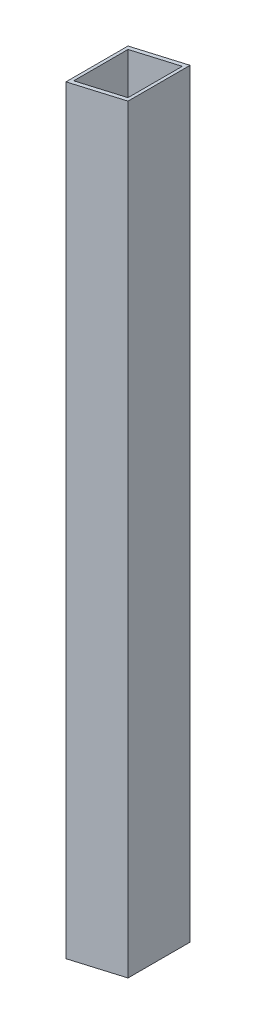
ISO-10303-21;
HEADER;
FILE_DESCRIPTION(('STEP AP214'),'2;1');
FILE_NAME('part.step','',(''),(''),'','','');
FILE_SCHEMA(('AUTOMOTIVE_DESIGN { 1 0 10303 214 1 1 1 1 }'));
ENDSEC;
DATA;
#1=APPLICATION_CONTEXT('core data for automotive mechanical design processes');
#2=APPLICATION_PROTOCOL_DEFINITION('international standard','automotive_design',2000,#1);
#3=PRODUCT_CONTEXT('',#1,'mechanical');
#4=PRODUCT('Part','Part','',(#3));
#5=PRODUCT_RELATED_PRODUCT_CATEGORY('part','',(#4));
#6=PRODUCT_DEFINITION_FORMATION('','',#4);
#7=PRODUCT_DEFINITION_CONTEXT('part definition',#1,'design');
#8=PRODUCT_DEFINITION('design','',#6,#7);
#9=PRODUCT_DEFINITION_SHAPE('','',#8);
#10=(LENGTH_UNIT() NAMED_UNIT(*) SI_UNIT(.MILLI.,.METRE.));
#11=(NAMED_UNIT(*) PLANE_ANGLE_UNIT() SI_UNIT($,.RADIAN.));
#12=(NAMED_UNIT(*) SI_UNIT($,.STERADIAN.) SOLID_ANGLE_UNIT());
#13=UNCERTAINTY_MEASURE_WITH_UNIT(LENGTH_MEASURE(1.E-05),#10,'distance_accuracy_value','');
#14=(GEOMETRIC_REPRESENTATION_CONTEXT(3) GLOBAL_UNCERTAINTY_ASSIGNED_CONTEXT((#13)) GLOBAL_UNIT_ASSIGNED_CONTEXT((#10,
#11,#12)) REPRESENTATION_CONTEXT('',''));
#15=CARTESIAN_POINT('',(0.,0.,0.));
#16=DIRECTION('',(0.,0.,1.));
#17=DIRECTION('',(1.,0.,0.));
#18=AXIS2_PLACEMENT_3D('',#15,#16,#17);
#19=CARTESIAN_POINT('',(0.,950.,0.));
#20=DIRECTION('',(1.,0.,0.));
#21=DIRECTION('',(0.,0.,-1.));
#22=AXIS2_PLACEMENT_3D('',#19,#20,#21);
#23=PLANE('',#22);
#24=DIRECTION('',(0.,-1.,0.));
#25=VECTOR('',#24,1.);
#26=CARTESIAN_POINT('',(0.,950.,76.2));
#27=LINE('',#26,#25);
#28=CARTESIAN_POINT('',(0.,932.407843836233,76.2));
#29=VERTEX_POINT('',#28);
#30=CARTESIAN_POINT('',(0.,0.,76.2));
#31=VERTEX_POINT('',#30);
#32=EDGE_CURVE('E118',#29,#31,#27,.T.);
#33=ORIENTED_EDGE('',*,*,#32,.F.);
#34=DIRECTION('',(0.,0.,1.));
#35=VECTOR('',#34,1.);
#36=CARTESIAN_POINT('',(0.,932.407843836233,0.));
#37=LINE('',#36,#35);
#38=CARTESIAN_POINT('',(0.,932.407843836233,0.));
#39=VERTEX_POINT('',#38);
#40=EDGE_CURVE('E103',#39,#29,#37,.T.);
#41=ORIENTED_EDGE('',*,*,#40,.F.);
#42=DIRECTION('',(0.,-1.,0.));
#43=VECTOR('',#42,1.);
#44=CARTESIAN_POINT('',(0.,950.,0.));
#45=LINE('',#44,#43);
#46=CARTESIAN_POINT('',(0.,0.,0.));
#47=VERTEX_POINT('',#46);
#48=EDGE_CURVE('E116',#39,#47,#45,.T.);
#49=ORIENTED_EDGE('',*,*,#48,.T.);
#50=DIRECTION('',(0.,0.,1.));
#51=VECTOR('',#50,1.);
#52=CARTESIAN_POINT('',(0.,0.,0.));
#53=LINE('',#52,#51);
#54=EDGE_CURVE('E128',#47,#31,#53,.T.);
#55=ORIENTED_EDGE('',*,*,#54,.T.);
#56=EDGE_LOOP('',(#33,#41,#49,#55));
#57=FACE_BOUND('',#56,.T.);
#58=ADVANCED_FACE('F36',(#57),#23,.F.);
#59=CARTESIAN_POINT('',(0.,950.,76.2));
#60=DIRECTION('',(0.,0.,-1.));
#61=DIRECTION('',(-1.,0.,0.));
#62=AXIS2_PLACEMENT_3D('',#59,#60,#61);
#63=PLANE('',#62);
#64=DIRECTION('',(0.,-1.,0.));
#65=VECTOR('',#64,1.);
#66=CARTESIAN_POINT('',(76.2,950.,76.2));
#67=LINE('',#66,#65);
#68=CARTESIAN_POINT('',(76.2,950.,76.2));
#69=VERTEX_POINT('',#68);
#70=CARTESIAN_POINT('',(76.2,17.592156163768,76.2));
#71=VERTEX_POINT('',#70);
#72=EDGE_CURVE('E126',#69,#71,#67,.T.);
#73=ORIENTED_EDGE('',*,*,#72,.F.);
#74=DIRECTION('',(0.974370064785237,0.224951054343859,0.));
#75=VECTOR('',#74,1.);
#76=CARTESIAN_POINT('',(76.2,950.,76.2));
#77=LINE('',#76,#75);
#78=EDGE_CURVE('E111',#29,#69,#77,.T.);
#79=ORIENTED_EDGE('',*,*,#78,.F.);
#80=ORIENTED_EDGE('',*,*,#32,.T.);
#81=DIRECTION('',(-0.974370064785235,-0.224951054343866,0.));
#82=VECTOR('',#81,1.);
#83=CARTESIAN_POINT('',(0.,0.,76.2));
#84=LINE('',#83,#82);
#85=EDGE_CURVE('E164',#71,#31,#84,.T.);
#86=ORIENTED_EDGE('',*,*,#85,.F.);
#87=EDGE_LOOP('',(#73,#79,#80,#86));
#88=FACE_BOUND('',#87,.T.);
#89=ADVANCED_FACE('F176',(#88),#63,.F.);
#90=CARTESIAN_POINT('',(76.2,950.,0.));
#91=DIRECTION('',(-1.,0.,0.));
#92=DIRECTION('',(0.,0.,1.));
#93=AXIS2_PLACEMENT_3D('',#90,#91,#92);
#94=PLANE('',#93);
#95=ORIENTED_EDGE('',*,*,#72,.T.);
#96=DIRECTION('',(0.,0.,1.));
#97=VECTOR('',#96,1.);
#98=CARTESIAN_POINT('',(76.2,17.592156163768,-78.2043730138564));
#99=LINE('',#98,#97);
#100=CARTESIAN_POINT('',(76.2,17.592156163768,0.));
#101=VERTEX_POINT('',#100);
#102=EDGE_CURVE('E165',#101,#71,#99,.T.);
#103=ORIENTED_EDGE('',*,*,#102,.F.);
#104=DIRECTION('',(0.,-1.,0.));
#105=VECTOR('',#104,1.);
#106=CARTESIAN_POINT('',(76.2,950.,0.));
#107=LINE('',#106,#105);
#108=CARTESIAN_POINT('',(76.2,950.,0.));
#109=VERTEX_POINT('',#108);
#110=EDGE_CURVE('E124',#109,#101,#107,.T.);
#111=ORIENTED_EDGE('',*,*,#110,.F.);
#112=DIRECTION('',(0.,0.,-1.));
#113=VECTOR('',#112,1.);
#114=CARTESIAN_POINT('',(76.2,950.,0.));
#115=LINE('',#114,#113);
#116=EDGE_CURVE('E106',#69,#109,#115,.T.);
#117=ORIENTED_EDGE('',*,*,#116,.F.);
#118=EDGE_LOOP('',(#95,#103,#111,#117));
#119=FACE_BOUND('',#118,.T.);
#120=ADVANCED_FACE('F178',(#119),#94,.F.);
#121=CARTESIAN_POINT('',(0.,950.,0.));
#122=DIRECTION('',(0.,0.,1.));
#123=DIRECTION('',(1.,0.,0.));
#124=AXIS2_PLACEMENT_3D('',#121,#122,#123);
#125=PLANE('',#124);
#126=ORIENTED_EDGE('',*,*,#48,.F.);
#127=DIRECTION('',(0.974370064785237,0.224951054343859,0.));
#128=VECTOR('',#127,1.);
#129=CARTESIAN_POINT('',(76.2,950.,0.));
#130=LINE('',#129,#128);
#131=EDGE_CURVE('E100',#39,#109,#130,.T.);
#132=ORIENTED_EDGE('',*,*,#131,.T.);
#133=ORIENTED_EDGE('',*,*,#110,.T.);
#134=DIRECTION('',(0.974370064785235,0.224951054343866,0.));
#135=VECTOR('',#134,1.);
#136=CARTESIAN_POINT('',(0.,0.,0.));
#137=LINE('',#136,#135);
#138=EDGE_CURVE('E123',#47,#101,#137,.T.);
#139=ORIENTED_EDGE('',*,*,#138,.F.);
#140=EDGE_LOOP('',(#126,#132,#133,#139));
#141=FACE_BOUND('',#140,.T.);
#142=ADVANCED_FACE('F122',(#141),#125,.F.);
#143=CARTESIAN_POINT('',(4.7625,950.,4.7625));
#144=DIRECTION('',(1.,0.,0.));
#145=DIRECTION('',(0.,0.,-1.));
#146=AXIS2_PLACEMENT_3D('',#143,#144,#145);
#147=PLANE('',#146);
#148=DIRECTION('',(0.,0.,-1.));
#149=VECTOR('',#148,1.);
#150=CARTESIAN_POINT('',(4.7625,933.507353596468,4.7625));
#151=LINE('',#150,#149);
#152=CARTESIAN_POINT('',(4.7625,933.507353596468,71.4375));
#153=VERTEX_POINT('',#152);
#154=CARTESIAN_POINT('',(4.7625,933.507353596468,4.7625));
#155=VERTEX_POINT('',#154);
#156=EDGE_CURVE('E49',#153,#155,#151,.T.);
#157=ORIENTED_EDGE('',*,*,#156,.F.);
#158=DIRECTION('',(0.,-1.,0.));
#159=VECTOR('',#158,1.);
#160=CARTESIAN_POINT('',(4.7625,950.,71.4375));
#161=LINE('',#160,#159);
#162=CARTESIAN_POINT('',(4.7625,1.09950976023533,71.4375));
#163=VERTEX_POINT('',#162);
#164=EDGE_CURVE('E151',#153,#163,#161,.T.);
#165=ORIENTED_EDGE('',*,*,#164,.T.);
#166=DIRECTION('',(0.,0.,1.));
#167=VECTOR('',#166,1.);
#168=CARTESIAN_POINT('',(4.7625,1.09950976023543,4.7625));
#169=LINE('',#168,#167);
#170=CARTESIAN_POINT('',(4.7625,1.09950976023533,4.7625));
#171=VERTEX_POINT('',#170);
#172=EDGE_CURVE('E142',#171,#163,#169,.T.);
#173=ORIENTED_EDGE('',*,*,#172,.F.);
#174=DIRECTION('',(0.,-1.,0.));
#175=VECTOR('',#174,1.);
#176=CARTESIAN_POINT('',(4.7625,950.,4.7625));
#177=LINE('',#176,#175);
#178=EDGE_CURVE('E149',#155,#171,#177,.T.);
#179=ORIENTED_EDGE('',*,*,#178,.F.);
#180=EDGE_LOOP('',(#157,#165,#173,#179));
#181=FACE_BOUND('',#180,.T.);
#182=ADVANCED_FACE('F148',(#181),#147,.T.);
#183=CARTESIAN_POINT('',(4.7625,950.,71.4375));
#184=DIRECTION('',(0.,0.,-1.));
#185=DIRECTION('',(-1.,0.,0.));
#186=AXIS2_PLACEMENT_3D('',#183,#184,#185);
#187=PLANE('',#186);
#188=DIRECTION('',(-0.974370064785237,-0.224951054343859,0.));
#189=VECTOR('',#188,1.);
#190=CARTESIAN_POINT('',(8.37745015875144,934.341930600628,71.4375));
#191=LINE('',#190,#189);
#192=CARTESIAN_POINT('',(71.4375,948.900490239765,71.4375));
#193=VERTEX_POINT('',#192);
#194=EDGE_CURVE('E170',#193,#153,#191,.T.);
#195=ORIENTED_EDGE('',*,*,#194,.F.);
#196=DIRECTION('',(0.,-1.,0.));
#197=VECTOR('',#196,1.);
#198=CARTESIAN_POINT('',(71.4375,950.,71.4375));
#199=LINE('',#198,#197);
#200=CARTESIAN_POINT('',(71.4375,16.4926464035324,71.4375));
#201=VERTEX_POINT('',#200);
#202=EDGE_CURVE('E159',#193,#201,#199,.T.);
#203=ORIENTED_EDGE('',*,*,#202,.T.);
#204=DIRECTION('',(0.974370064785235,0.224951054343866,0.));
#205=VECTOR('',#204,1.);
#206=CARTESIAN_POINT('',(212.747798047562,49.1166993011873,71.4375));
#207=LINE('',#206,#205);
#208=EDGE_CURVE('E152',#163,#201,#207,.T.);
#209=ORIENTED_EDGE('',*,*,#208,.F.);
#210=ORIENTED_EDGE('',*,*,#164,.F.);
#211=EDGE_LOOP('',(#195,#203,#209,#210));
#212=FACE_BOUND('',#211,.T.);
#213=ADVANCED_FACE('F213',(#212),#187,.T.);
#214=CARTESIAN_POINT('',(71.4375,950.,4.7625));
#215=DIRECTION('',(-1.,0.,0.));
#216=DIRECTION('',(0.,0.,1.));
#217=AXIS2_PLACEMENT_3D('',#214,#215,#216);
#218=PLANE('',#217);
#219=DIRECTION('',(0.,0.,1.));
#220=VECTOR('',#219,1.);
#221=CARTESIAN_POINT('',(71.4375,948.900490239765,4.7625));
#222=LINE('',#221,#220);
#223=CARTESIAN_POINT('',(71.4375,948.900490239765,4.7625));
#224=VERTEX_POINT('',#223);
#225=EDGE_CURVE('E119',#224,#193,#222,.T.);
#226=ORIENTED_EDGE('',*,*,#225,.F.);
#227=DIRECTION('',(0.,-1.,0.));
#228=VECTOR('',#227,1.);
#229=CARTESIAN_POINT('',(71.4375,950.,4.7625));
#230=LINE('',#229,#228);
#231=CARTESIAN_POINT('',(71.4375,16.4926464035324,4.7625));
#232=VERTEX_POINT('',#231);
#233=EDGE_CURVE('E57',#224,#232,#230,.T.);
#234=ORIENTED_EDGE('',*,*,#233,.T.);
#235=DIRECTION('',(0.,0.,-1.));
#236=VECTOR('',#235,1.);
#237=CARTESIAN_POINT('',(71.4375,16.4926464035324,4.7625));
#238=LINE('',#237,#236);
#239=EDGE_CURVE('E144',#201,#232,#238,.T.);
#240=ORIENTED_EDGE('',*,*,#239,.F.);
#241=ORIENTED_EDGE('',*,*,#202,.F.);
#242=EDGE_LOOP('',(#226,#234,#240,#241));
#243=FACE_BOUND('',#242,.T.);
#244=ADVANCED_FACE('F222',(#243),#218,.T.);
#245=CARTESIAN_POINT('',(4.7625,950.,4.7625));
#246=DIRECTION('',(0.,0.,1.));
#247=DIRECTION('',(1.,0.,0.));
#248=AXIS2_PLACEMENT_3D('',#245,#246,#247);
#249=PLANE('',#248);
#250=DIRECTION('',(0.974370064785237,0.224951054343859,0.));
#251=VECTOR('',#250,1.);
#252=CARTESIAN_POINT('',(8.37745015875144,934.341930600628,4.7625));
#253=LINE('',#252,#251);
#254=EDGE_CURVE('E11',#155,#224,#253,.T.);
#255=ORIENTED_EDGE('',*,*,#254,.F.);
#256=ORIENTED_EDGE('',*,*,#178,.T.);
#257=DIRECTION('',(-0.974370064785235,-0.224951054343866,0.));
#258=VECTOR('',#257,1.);
#259=CARTESIAN_POINT('',(212.747798047562,49.1166993011873,4.7625));
#260=LINE('',#259,#258);
#261=EDGE_CURVE('E43',#232,#171,#260,.T.);
#262=ORIENTED_EDGE('',*,*,#261,.F.);
#263=ORIENTED_EDGE('',*,*,#233,.F.);
#264=EDGE_LOOP('',(#255,#256,#262,#263));
#265=FACE_BOUND('',#264,.T.);
#266=ADVANCED_FACE('F232',(#265),#249,.T.);
#267=CARTESIAN_POINT('',(0.,0.,-78.2043730138564));
#268=DIRECTION('',(-0.224951054343866,0.974370064785235,0.));
#269=DIRECTION('',(-0.974370064785235,-0.224951054343866,0.));
#270=AXIS2_PLACEMENT_3D('',#267,#268,#269);
#271=PLANE('',#270);
#272=ORIENTED_EDGE('',*,*,#172,.T.);
#273=ORIENTED_EDGE('',*,*,#208,.T.);
#274=ORIENTED_EDGE('',*,*,#239,.T.);
#275=ORIENTED_EDGE('',*,*,#261,.T.);
#276=EDGE_LOOP('',(#272,#273,#274,#275));
#277=FACE_BOUND('',#276,.T.);
#278=ORIENTED_EDGE('',*,*,#138,.T.);
#279=ORIENTED_EDGE('',*,*,#102,.T.);
#280=ORIENTED_EDGE('',*,*,#85,.T.);
#281=ORIENTED_EDGE('',*,*,#54,.F.);
#282=EDGE_LOOP('',(#278,#279,#280,#281));
#283=FACE_BOUND('',#282,.T.);
#284=ADVANCED_FACE('F139',(#277,#283),#271,.F.);
#285=CARTESIAN_POINT('',(76.2,950.,0.));
#286=DIRECTION('',(0.224951054343859,-0.974370064785236,0.));
#287=DIRECTION('',(0.974370064785237,0.224951054343859,0.));
#288=AXIS2_PLACEMENT_3D('',#285,#286,#287);
#289=PLANE('',#288);
#290=ORIENTED_EDGE('',*,*,#156,.T.);
#291=ORIENTED_EDGE('',*,*,#254,.T.);
#292=ORIENTED_EDGE('',*,*,#225,.T.);
#293=ORIENTED_EDGE('',*,*,#194,.T.);
#294=EDGE_LOOP('',(#290,#291,#292,#293));
#295=FACE_BOUND('',#294,.T.);
#296=ORIENTED_EDGE('',*,*,#78,.T.);
#297=ORIENTED_EDGE('',*,*,#116,.T.);
#298=ORIENTED_EDGE('',*,*,#131,.F.);
#299=ORIENTED_EDGE('',*,*,#40,.T.);
#300=EDGE_LOOP('',(#296,#297,#298,#299));
#301=FACE_BOUND('',#300,.T.);
#302=ADVANCED_FACE('F102',(#295,#301),#289,.F.);
#303=CLOSED_SHELL('',(#58,#89,#120,#142,#182,#213,#244,#266,#284,#302));
#304=MANIFOLD_SOLID_BREP('B2',#303);
#305=ADVANCED_BREP_SHAPE_REPRESENTATION('',(#18,#304),#14);
#306=SHAPE_DEFINITION_REPRESENTATION(#9,#305);
ENDSEC;
END-ISO-10303-21;
